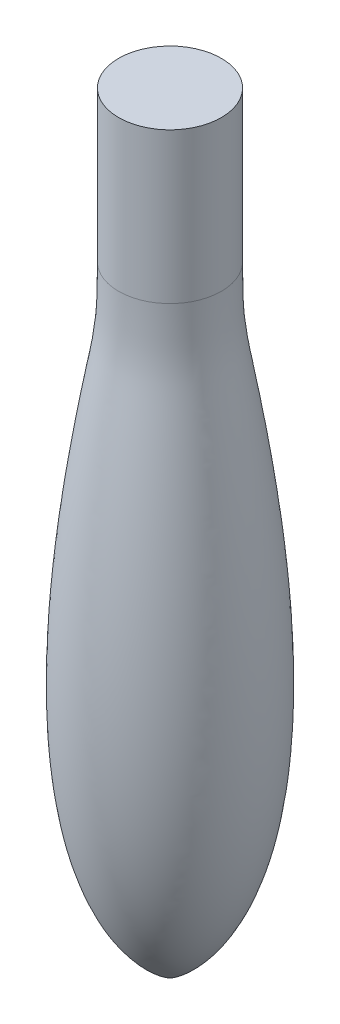
ISO-10303-21;
HEADER;
FILE_DESCRIPTION(('STEP AP214'),'2;1');
FILE_NAME('part.step','',(''),(''),'','','');
FILE_SCHEMA(('AUTOMOTIVE_DESIGN { 1 0 10303 214 1 1 1 1 }'));
ENDSEC;
DATA;
#1=APPLICATION_CONTEXT('core data for automotive mechanical design processes');
#2=APPLICATION_PROTOCOL_DEFINITION('international standard','automotive_design',2000,#1);
#3=PRODUCT_CONTEXT('',#1,'mechanical');
#4=PRODUCT('Part','Part','',(#3));
#5=PRODUCT_RELATED_PRODUCT_CATEGORY('part','',(#4));
#6=PRODUCT_DEFINITION_FORMATION('','',#4);
#7=PRODUCT_DEFINITION_CONTEXT('part definition',#1,'design');
#8=PRODUCT_DEFINITION('design','',#6,#7);
#9=PRODUCT_DEFINITION_SHAPE('','',#8);
#10=(LENGTH_UNIT() NAMED_UNIT(*) SI_UNIT(.MILLI.,.METRE.));
#11=(NAMED_UNIT(*) PLANE_ANGLE_UNIT() SI_UNIT($,.RADIAN.));
#12=(NAMED_UNIT(*) SI_UNIT($,.STERADIAN.) SOLID_ANGLE_UNIT());
#13=UNCERTAINTY_MEASURE_WITH_UNIT(LENGTH_MEASURE(1.E-05),#10,'distance_accuracy_value','');
#14=(GEOMETRIC_REPRESENTATION_CONTEXT(3) GLOBAL_UNCERTAINTY_ASSIGNED_CONTEXT((#13)) GLOBAL_UNIT_ASSIGNED_CONTEXT((#10,
#11,#12)) REPRESENTATION_CONTEXT('',''));
#15=CARTESIAN_POINT('',(0.,0.,0.));
#16=DIRECTION('',(0.,0.,1.));
#17=DIRECTION('',(1.,0.,0.));
#18=AXIS2_PLACEMENT_3D('',#15,#16,#17);
#19=CARTESIAN_POINT('',(0.,29.3,0.));
#20=DIRECTION('',(0.,1.,0.));
#21=DIRECTION('',(0.,0.,1.));
#22=AXIS2_PLACEMENT_3D('',#19,#20,#21);
#23=CYLINDRICAL_SURFACE('',#22,10.);
#24=CARTESIAN_POINT('',(0.,0.,0.));
#25=DIRECTION('',(0.,1.,0.));
#26=DIRECTION('',(0.,0.,1.));
#27=AXIS2_PLACEMENT_3D('',#24,#25,#26);
#28=CIRCLE('',#27,10.);
#29=CARTESIAN_POINT('',(0.,0.,10.));
#30=VERTEX_POINT('',#29);
#31=EDGE_CURVE('E11',#30,#30,#28,.T.);
#32=ORIENTED_EDGE('',*,*,#31,.T.);
#33=EDGE_LOOP('',(#32));
#34=FACE_BOUND('',#33,.T.);
#35=CARTESIAN_POINT('',(0.,29.3,0.));
#36=DIRECTION('',(0.,1.,0.));
#37=DIRECTION('',(0.,0.,1.));
#38=AXIS2_PLACEMENT_3D('',#35,#36,#37);
#39=CIRCLE('',#38,9.99999999999999);
#40=CARTESIAN_POINT('',(0.,29.3,10.));
#41=VERTEX_POINT('',#40);
#42=EDGE_CURVE('E46',#41,#41,#39,.T.);
#43=ORIENTED_EDGE('',*,*,#42,.F.);
#44=EDGE_LOOP('',(#43));
#45=FACE_BOUND('',#44,.T.);
#46=ADVANCED_FACE('F39',(#34,#45),#23,.T.);
#47=CARTESIAN_POINT('',(0.,0.,-9.99999999999998));
#48=CARTESIAN_POINT('',(0.,-9.37503948065329,-9.99999999999998));
#49=CARTESIAN_POINT('',(0.,-16.0996094771221,-11.1653652540159));
#50=CARTESIAN_POINT('',(0.,-104.84141759839,-26.6387974388793));
#51=CARTESIAN_POINT('',(0.,-120.7,0.));
#52=B_SPLINE_CURVE_WITH_KNOTS('',3,(#47,#48,#49,#50,#51),.UNSPECIFIED.,.F.,.F.,(4,1,4),(0.,
0.245942112494307,1.),.UNSPECIFIED.);
#53=CARTESIAN_POINT('',(0.,29.3,0.));
#54=DIRECTION('',(0.,1.,0.));
#55=AXIS1_PLACEMENT('',#53,#54);
#56=SURFACE_OF_REVOLUTION('',#52,#55);
#57=CARTESIAN_POINT('',(0.,-120.7,0.));
#58=VERTEX_POINT('',#57);
#59=VERTEX_LOOP('',#58);
#60=FACE_BOUND('',#59,.T.);
#61=ORIENTED_EDGE('',*,*,#31,.F.);
#62=EDGE_LOOP('',(#61));
#63=FACE_BOUND('',#62,.T.);
#64=ADVANCED_FACE('F49',(#60,#63),#56,.F.);
#65=CARTESIAN_POINT('',(0.,29.3,0.));
#66=DIRECTION('',(0.,1.,0.));
#67=DIRECTION('',(0.,0.,1.));
#68=AXIS2_PLACEMENT_3D('',#65,#66,#67);
#69=PLANE('',#68);
#70=ORIENTED_EDGE('',*,*,#42,.T.);
#71=EDGE_LOOP('',(#70));
#72=FACE_BOUND('',#71,.T.);
#73=ADVANCED_FACE('F52',(#72),#69,.T.);
#74=CLOSED_SHELL('',(#46,#64,#73));
#75=MANIFOLD_SOLID_BREP('B2',#74);
#76=ADVANCED_BREP_SHAPE_REPRESENTATION('',(#18,#75),#14);
#77=SHAPE_DEFINITION_REPRESENTATION(#9,#76);
ENDSEC;
END-ISO-10303-21;
